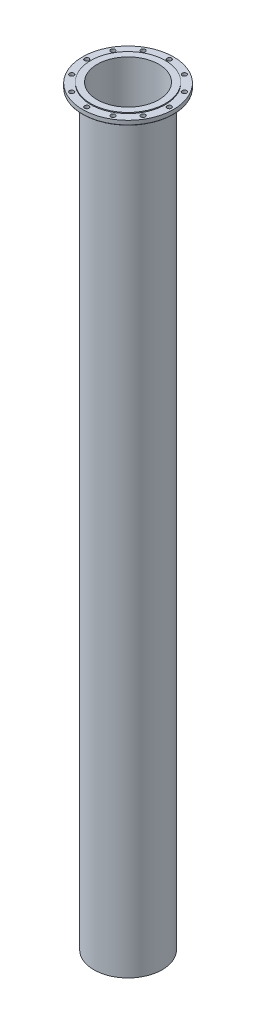
ISO-10303-21;
HEADER;
FILE_DESCRIPTION(('STEP AP214'),'2;1');
FILE_NAME('part.step','',(''),(''),'','','');
FILE_SCHEMA(('AUTOMOTIVE_DESIGN { 1 0 10303 214 1 1 1 1 }'));
ENDSEC;
DATA;
#1=APPLICATION_CONTEXT('core data for automotive mechanical design processes');
#2=APPLICATION_PROTOCOL_DEFINITION('international standard','automotive_design',2000,#1);
#3=PRODUCT_CONTEXT('',#1,'mechanical');
#4=PRODUCT('Part','Part','',(#3));
#5=PRODUCT_RELATED_PRODUCT_CATEGORY('part','',(#4));
#6=PRODUCT_DEFINITION_FORMATION('','',#4);
#7=PRODUCT_DEFINITION_CONTEXT('part definition',#1,'design');
#8=PRODUCT_DEFINITION('design','',#6,#7);
#9=PRODUCT_DEFINITION_SHAPE('','',#8);
#10=(LENGTH_UNIT() NAMED_UNIT(*) SI_UNIT(.MILLI.,.METRE.));
#11=(NAMED_UNIT(*) PLANE_ANGLE_UNIT() SI_UNIT($,.RADIAN.));
#12=(NAMED_UNIT(*) SI_UNIT($,.STERADIAN.) SOLID_ANGLE_UNIT());
#13=UNCERTAINTY_MEASURE_WITH_UNIT(LENGTH_MEASURE(1.E-05),#10,'distance_accuracy_value','');
#14=(GEOMETRIC_REPRESENTATION_CONTEXT(3) GLOBAL_UNCERTAINTY_ASSIGNED_CONTEXT((#13)) GLOBAL_UNIT_ASSIGNED_CONTEXT((#10,
#11,#12)) REPRESENTATION_CONTEXT('',''));
#15=CARTESIAN_POINT('',(0.,0.,0.));
#16=DIRECTION('',(0.,0.,1.));
#17=DIRECTION('',(1.,0.,0.));
#18=AXIS2_PLACEMENT_3D('',#15,#16,#17);
#19=CARTESIAN_POINT('',(-12.8203346951603,-35.3975581395349,2.47179827369602E-13));
#20=DIRECTION('',(0.,-1.,0.));
#21=DIRECTION('',(0.,0.,-1.));
#22=AXIS2_PLACEMENT_3D('',#19,#20,#21);
#23=CYLINDRICAL_SURFACE('',#22,125.);
#24=CARTESIAN_POINT('',(-12.8203346951603,17.6024418604651,2.47179827369602E-13));
#25=DIRECTION('',(0.,-1.,0.));
#26=DIRECTION('',(0.,0.,-1.));
#27=AXIS2_PLACEMENT_3D('',#24,#25,#26);
#28=CIRCLE('',#27,125.);
#29=CARTESIAN_POINT('',(-12.8203346951603,17.6024418604651,-125.));
#30=VERTEX_POINT('',#29);
#31=EDGE_CURVE('E10',#30,#30,#28,.T.);
#32=ORIENTED_EDGE('',*,*,#31,.F.);
#33=EDGE_LOOP('',(#32));
#34=FACE_BOUND('',#33,.T.);
#35=CARTESIAN_POINT('',(-12.8203346951603,-3035.39755813953,2.47179827369602E-13));
#36=DIRECTION('',(0.,-1.,0.));
#37=DIRECTION('',(0.,0.,-1.));
#38=AXIS2_PLACEMENT_3D('',#35,#36,#37);
#39=CIRCLE('',#38,125.);
#40=CARTESIAN_POINT('',(-12.8203346951603,-3035.39755813953,-125.));
#41=VERTEX_POINT('',#40);
#42=EDGE_CURVE('E243',#41,#41,#39,.T.);
#43=ORIENTED_EDGE('',*,*,#42,.T.);
#44=EDGE_LOOP('',(#43));
#45=FACE_BOUND('',#44,.T.);
#46=ADVANCED_FACE('F34',(#34,#45),#23,.F.);
#47=CARTESIAN_POINT('',(-164.32033469516,17.6024418604651,2.47179827369602E-13));
#48=DIRECTION('',(0.,-1.,0.));
#49=DIRECTION('',(0.,0.,-1.));
#50=AXIS2_PLACEMENT_3D('',#47,#48,#49);
#51=PLANE('',#50);
#52=CARTESIAN_POINT('',(-12.8203346951603,17.6024418604651,2.47179827369602E-13));
#53=DIRECTION('',(0.,-1.,0.));
#54=DIRECTION('',(0.,0.,-1.));
#55=AXIS2_PLACEMENT_3D('',#52,#53,#54);
#56=CIRCLE('',#55,151.5);
#57=CARTESIAN_POINT('',(-12.8203346951603,17.6024418604651,-151.5));
#58=VERTEX_POINT('',#57);
#59=EDGE_CURVE('E41',#58,#58,#56,.T.);
#60=ORIENTED_EDGE('',*,*,#59,.F.);
#61=EDGE_LOOP('',(#60));
#62=FACE_BOUND('',#61,.T.);
#63=ORIENTED_EDGE('',*,*,#31,.T.);
#64=EDGE_LOOP('',(#63));
#65=FACE_BOUND('',#64,.T.);
#66=ADVANCED_FACE('F148',(#62,#65),#51,.F.);
#67=CARTESIAN_POINT('',(-12.8203346951603,-35.3975581395349,2.47179827369602E-13));
#68=DIRECTION('',(0.,-1.,0.));
#69=DIRECTION('',(0.,0.,-1.));
#70=AXIS2_PLACEMENT_3D('',#67,#68,#69);
#71=CYLINDRICAL_SURFACE('',#70,151.5);
#72=CARTESIAN_POINT('',(-12.8203346951603,13.6024418604651,2.47179827369602E-13));
#73=DIRECTION('',(0.,-1.,0.));
#74=DIRECTION('',(0.,0.,-1.));
#75=AXIS2_PLACEMENT_3D('',#72,#73,#74);
#76=CIRCLE('',#75,151.5);
#77=CARTESIAN_POINT('',(-12.8203346951603,13.6024418604651,-151.5));
#78=VERTEX_POINT('',#77);
#79=EDGE_CURVE('E46',#78,#78,#76,.T.);
#80=ORIENTED_EDGE('',*,*,#79,.F.);
#81=EDGE_LOOP('',(#80));
#82=FACE_BOUND('',#81,.T.);
#83=ORIENTED_EDGE('',*,*,#59,.T.);
#84=EDGE_LOOP('',(#83));
#85=FACE_BOUND('',#84,.T.);
#86=ADVANCED_FACE('F145',(#82,#85),#71,.T.);
#87=CARTESIAN_POINT('',(-164.32033469516,13.6024418604651,2.47179827369602E-13));
#88=DIRECTION('',(0.,-1.,0.));
#89=DIRECTION('',(0.,0.,-1.));
#90=AXIS2_PLACEMENT_3D('',#87,#88,#89);
#91=PLANE('',#90);
#92=CARTESIAN_POINT('',(-157.879589829055,13.6024418604651,83.7499999999984));
#93=DIRECTION('',(0.,1.,0.));
#94=DIRECTION('',(0.,0.,1.));
#95=AXIS2_PLACEMENT_3D('',#92,#93,#94);
#96=CIRCLE('',#95,9.00000000000001);
#97=CARTESIAN_POINT('',(-157.879589829055,13.6024418604651,92.7499999999984));
#98=VERTEX_POINT('',#97);
#99=EDGE_CURVE('E102',#98,#98,#96,.T.);
#100=ORIENTED_EDGE('',*,*,#99,.F.);
#101=EDGE_LOOP('',(#100));
#102=FACE_BOUND('',#101,.T.);
#103=CARTESIAN_POINT('',(-96.570334695162,13.6024418604651,145.059255133893));
#104=DIRECTION('',(0.,1.,0.));
#105=DIRECTION('',(0.,0.,1.));
#106=AXIS2_PLACEMENT_3D('',#103,#104,#105);
#107=CIRCLE('',#106,9.);
#108=CARTESIAN_POINT('',(-96.570334695162,13.6024418604651,154.059255133893));
#109=VERTEX_POINT('',#108);
#110=EDGE_CURVE('E92',#109,#109,#107,.T.);
#111=ORIENTED_EDGE('',*,*,#110,.F.);
#112=EDGE_LOOP('',(#111));
#113=FACE_BOUND('',#112,.T.);
#114=CARTESIAN_POINT('',(-12.820334695162,13.6024418604651,167.5));
#115=DIRECTION('',(0.,1.,0.));
#116=DIRECTION('',(0.,0.,1.));
#117=AXIS2_PLACEMENT_3D('',#114,#115,#116);
#118=CIRCLE('',#117,9.);
#119=CARTESIAN_POINT('',(-12.820334695162,13.6024418604651,176.5));
#120=VERTEX_POINT('',#119);
#121=EDGE_CURVE('E89',#120,#120,#118,.T.);
#122=ORIENTED_EDGE('',*,*,#121,.F.);
#123=EDGE_LOOP('',(#122));
#124=FACE_BOUND('',#123,.T.);
#125=CARTESIAN_POINT('',(70.9296653048384,13.6024418604651,145.059255133894));
#126=DIRECTION('',(0.,1.,0.));
#127=DIRECTION('',(0.,0.,1.));
#128=AXIS2_PLACEMENT_3D('',#125,#126,#127);
#129=CIRCLE('',#128,9.);
#130=CARTESIAN_POINT('',(70.9296653048384,13.6024418604651,154.059255133894));
#131=VERTEX_POINT('',#130);
#132=EDGE_CURVE('E86',#131,#131,#129,.T.);
#133=ORIENTED_EDGE('',*,*,#132,.F.);
#134=EDGE_LOOP('',(#133));
#135=FACE_BOUND('',#134,.T.);
#136=CARTESIAN_POINT('',(132.238920438732,13.6024418604651,83.7500000000014));
#137=DIRECTION('',(0.,1.,0.));
#138=DIRECTION('',(0.,0.,1.));
#139=AXIS2_PLACEMENT_3D('',#136,#137,#138);
#140=CIRCLE('',#139,9.00000000000001);
#141=CARTESIAN_POINT('',(132.238920438732,13.6024418604651,92.7500000000014));
#142=VERTEX_POINT('',#141);
#143=EDGE_CURVE('E82',#142,#142,#140,.T.);
#144=ORIENTED_EDGE('',*,*,#143,.F.);
#145=EDGE_LOOP('',(#144));
#146=FACE_BOUND('',#145,.T.);
#147=CARTESIAN_POINT('',(154.67966530484,13.6024418604651,1.4187426741053E-12));
#148=DIRECTION('',(0.,1.,0.));
#149=DIRECTION('',(0.,0.,1.));
#150=AXIS2_PLACEMENT_3D('',#147,#148,#149);
#151=CIRCLE('',#150,9.00000000000001);
#152=CARTESIAN_POINT('',(154.67966530484,13.6024418604651,9.00000000000143));
#153=VERTEX_POINT('',#152);
#154=EDGE_CURVE('E78',#153,#153,#151,.T.);
#155=ORIENTED_EDGE('',*,*,#154,.F.);
#156=EDGE_LOOP('',(#155));
#157=FACE_BOUND('',#156,.T.);
#158=CARTESIAN_POINT('',(132.238920438734,13.6024418604651,-83.7499999999989));
#159=DIRECTION('',(0.,1.,0.));
#160=DIRECTION('',(0.,0.,1.));
#161=AXIS2_PLACEMENT_3D('',#158,#159,#160);
#162=CIRCLE('',#161,9.00000000000001);
#163=CARTESIAN_POINT('',(132.238920438734,13.6024418604651,-74.7499999999989));
#164=VERTEX_POINT('',#163);
#165=EDGE_CURVE('E74',#164,#164,#162,.T.);
#166=ORIENTED_EDGE('',*,*,#165,.F.);
#167=EDGE_LOOP('',(#166));
#168=FACE_BOUND('',#167,.T.);
#169=CARTESIAN_POINT('',(-12.8203346951597,13.6024418604651,-167.5));
#170=DIRECTION('',(0.,1.,0.));
#171=DIRECTION('',(0.,0.,1.));
#172=AXIS2_PLACEMENT_3D('',#169,#170,#171);
#173=CIRCLE('',#172,9.);
#174=CARTESIAN_POINT('',(-12.8203346951597,13.6024418604651,-158.5));
#175=VERTEX_POINT('',#174);
#176=EDGE_CURVE('E70',#175,#175,#173,.T.);
#177=ORIENTED_EDGE('',*,*,#176,.F.);
#178=EDGE_LOOP('',(#177));
#179=FACE_BOUND('',#178,.T.);
#180=CARTESIAN_POINT('',(-96.5703346951579,13.6024418604651,-145.059255133895));
#181=DIRECTION('',(0.,1.,0.));
#182=DIRECTION('',(0.,0.,1.));
#183=AXIS2_PLACEMENT_3D('',#180,#181,#182);
#184=CIRCLE('',#183,9.);
#185=CARTESIAN_POINT('',(-96.5703346951579,13.6024418604651,-136.059255133895));
#186=VERTEX_POINT('',#185);
#187=EDGE_CURVE('E66',#186,#186,#184,.T.);
#188=ORIENTED_EDGE('',*,*,#187,.F.);
#189=EDGE_LOOP('',(#188));
#190=FACE_BOUND('',#189,.T.);
#191=CARTESIAN_POINT('',(-157.879589829052,13.6024418604651,-83.7500000000019));
#192=DIRECTION('',(0.,1.,0.));
#193=DIRECTION('',(0.,0.,1.));
#194=AXIS2_PLACEMENT_3D('',#191,#192,#193);
#195=CIRCLE('',#194,9.00000000000001);
#196=CARTESIAN_POINT('',(-157.879589829052,13.6024418604651,-74.7500000000019));
#197=VERTEX_POINT('',#196);
#198=EDGE_CURVE('E62',#197,#197,#195,.T.);
#199=ORIENTED_EDGE('',*,*,#198,.F.);
#200=EDGE_LOOP('',(#199));
#201=FACE_BOUND('',#200,.T.);
#202=CARTESIAN_POINT('',(70.9296653048404,13.6024418604651,-145.059255133893));
#203=DIRECTION('',(0.,1.,0.));
#204=DIRECTION('',(0.,0.,1.));
#205=AXIS2_PLACEMENT_3D('',#202,#203,#204);
#206=CIRCLE('',#205,9.);
#207=CARTESIAN_POINT('',(70.9296653048404,13.6024418604651,-136.059255133893));
#208=VERTEX_POINT('',#207);
#209=EDGE_CURVE('E58',#208,#208,#206,.T.);
#210=ORIENTED_EDGE('',*,*,#209,.F.);
#211=EDGE_LOOP('',(#210));
#212=FACE_BOUND('',#211,.T.);
#213=CARTESIAN_POINT('',(-180.32033469516,13.6024418604651,2.47179827369602E-13));
#214=DIRECTION('',(0.,1.,0.));
#215=DIRECTION('',(0.,0.,1.));
#216=AXIS2_PLACEMENT_3D('',#213,#214,#215);
#217=CIRCLE('',#216,9.00000000000001);
#218=CARTESIAN_POINT('',(-180.32033469516,13.6024418604651,9.00000000000026));
#219=VERTEX_POINT('',#218);
#220=EDGE_CURVE('E54',#219,#219,#217,.T.);
#221=ORIENTED_EDGE('',*,*,#220,.F.);
#222=EDGE_LOOP('',(#221));
#223=FACE_BOUND('',#222,.T.);
#224=CARTESIAN_POINT('',(-12.8203346951603,13.6024418604651,2.47179827369602E-13));
#225=DIRECTION('',(0.,-1.,0.));
#226=DIRECTION('',(0.,0.,-1.));
#227=AXIS2_PLACEMENT_3D('',#224,#225,#226);
#228=CIRCLE('',#227,185.);
#229=CARTESIAN_POINT('',(-12.8203346951603,13.6024418604651,-185.));
#230=VERTEX_POINT('',#229);
#231=EDGE_CURVE('E138',#230,#230,#228,.T.);
#232=ORIENTED_EDGE('',*,*,#231,.F.);
#233=EDGE_LOOP('',(#232));
#234=FACE_BOUND('',#233,.T.);
#235=ORIENTED_EDGE('',*,*,#79,.T.);
#236=EDGE_LOOP('',(#235));
#237=FACE_BOUND('',#236,.T.);
#238=ADVANCED_FACE('F143',(#102,#113,#124,#135,#146,#157,#168,#179,#190,#201,#212,#223,#234,
#237),#91,.F.);
#239=CARTESIAN_POINT('',(-12.8203346951603,-35.3975581395349,2.47179827369602E-13));
#240=DIRECTION('',(0.,-1.,0.));
#241=DIRECTION('',(0.,0.,-1.));
#242=AXIS2_PLACEMENT_3D('',#239,#240,#241);
#243=CYLINDRICAL_SURFACE('',#242,185.);
#244=CARTESIAN_POINT('',(-12.8203346951603,-2.39755813953486,2.47179827369602E-13));
#245=DIRECTION('',(0.,-1.,0.));
#246=DIRECTION('',(0.,0.,-1.));
#247=AXIS2_PLACEMENT_3D('',#244,#245,#246);
#248=CIRCLE('',#247,185.);
#249=CARTESIAN_POINT('',(-12.8203346951603,-2.39755813953486,-185.));
#250=VERTEX_POINT('',#249);
#251=EDGE_CURVE('E135',#250,#250,#248,.T.);
#252=ORIENTED_EDGE('',*,*,#251,.F.);
#253=EDGE_LOOP('',(#252));
#254=FACE_BOUND('',#253,.T.);
#255=ORIENTED_EDGE('',*,*,#231,.T.);
#256=EDGE_LOOP('',(#255));
#257=FACE_BOUND('',#256,.T.);
#258=ADVANCED_FACE('F160',(#254,#257),#243,.T.);
#259=CARTESIAN_POINT('',(-12.8203346951603,-2.39755813953486,2.47179827369602E-13));
#260=DIRECTION('',(0.,-1.,0.));
#261=DIRECTION('',(0.,0.,-1.));
#262=AXIS2_PLACEMENT_3D('',#259,#260,#261);
#263=TOROIDAL_SURFACE('',#262,183.,2.);
#264=CARTESIAN_POINT('',(-12.8203346951603,-4.39755813953487,2.47179827369602E-13));
#265=DIRECTION('',(0.,-1.,0.));
#266=DIRECTION('',(0.,0.,-1.));
#267=AXIS2_PLACEMENT_3D('',#264,#265,#266);
#268=CIRCLE('',#267,183.);
#269=CARTESIAN_POINT('',(-12.8203346951603,-4.39755813953487,-183.));
#270=VERTEX_POINT('',#269);
#271=EDGE_CURVE('E132',#270,#270,#268,.T.);
#272=ORIENTED_EDGE('',*,*,#271,.F.);
#273=EDGE_LOOP('',(#272));
#274=FACE_BOUND('',#273,.T.);
#275=ORIENTED_EDGE('',*,*,#251,.T.);
#276=EDGE_LOOP('',(#275));
#277=FACE_BOUND('',#276,.T.);
#278=ADVANCED_FACE('F164',(#274,#277),#263,.T.);
#279=CARTESIAN_POINT('',(-195.82033469516,-4.39755813953487,2.47179827369602E-13));
#280=DIRECTION('',(0.,1.,0.));
#281=DIRECTION('',(0.,0.,1.));
#282=AXIS2_PLACEMENT_3D('',#279,#280,#281);
#283=PLANE('',#282);
#284=CARTESIAN_POINT('',(-157.879589829055,-4.39755813953487,83.7499999999984));
#285=DIRECTION('',(0.,1.,0.));
#286=DIRECTION('',(0.,0.,1.));
#287=AXIS2_PLACEMENT_3D('',#284,#285,#286);
#288=CIRCLE('',#287,9.00000000000001);
#289=CARTESIAN_POINT('',(-157.879589829055,-4.39755813953487,92.7499999999984));
#290=VERTEX_POINT('',#289);
#291=EDGE_CURVE('E37',#290,#290,#288,.T.);
#292=ORIENTED_EDGE('',*,*,#291,.T.);
#293=EDGE_LOOP('',(#292));
#294=FACE_BOUND('',#293,.T.);
#295=CARTESIAN_POINT('',(-96.570334695162,-4.39755813953487,145.059255133893));
#296=DIRECTION('',(0.,1.,0.));
#297=DIRECTION('',(0.,0.,1.));
#298=AXIS2_PLACEMENT_3D('',#295,#296,#297);
#299=CIRCLE('',#298,9.);
#300=CARTESIAN_POINT('',(-96.570334695162,-4.39755813953487,154.059255133893));
#301=VERTEX_POINT('',#300);
#302=EDGE_CURVE('E90',#301,#301,#299,.T.);
#303=ORIENTED_EDGE('',*,*,#302,.T.);
#304=EDGE_LOOP('',(#303));
#305=FACE_BOUND('',#304,.T.);
#306=CARTESIAN_POINT('',(-12.820334695162,-4.39755813953487,167.5));
#307=DIRECTION('',(0.,1.,0.));
#308=DIRECTION('',(0.,0.,1.));
#309=AXIS2_PLACEMENT_3D('',#306,#307,#308);
#310=CIRCLE('',#309,9.);
#311=CARTESIAN_POINT('',(-12.820334695162,-4.39755813953487,176.5));
#312=VERTEX_POINT('',#311);
#313=EDGE_CURVE('E87',#312,#312,#310,.T.);
#314=ORIENTED_EDGE('',*,*,#313,.T.);
#315=EDGE_LOOP('',(#314));
#316=FACE_BOUND('',#315,.T.);
#317=CARTESIAN_POINT('',(70.9296653048384,-4.39755813953487,145.059255133894));
#318=DIRECTION('',(0.,1.,0.));
#319=DIRECTION('',(0.,0.,1.));
#320=AXIS2_PLACEMENT_3D('',#317,#318,#319);
#321=CIRCLE('',#320,9.);
#322=CARTESIAN_POINT('',(70.9296653048384,-4.39755813953487,154.059255133894));
#323=VERTEX_POINT('',#322);
#324=EDGE_CURVE('E83',#323,#323,#321,.T.);
#325=ORIENTED_EDGE('',*,*,#324,.T.);
#326=EDGE_LOOP('',(#325));
#327=FACE_BOUND('',#326,.T.);
#328=CARTESIAN_POINT('',(132.238920438732,-4.39755813953487,83.7500000000014));
#329=DIRECTION('',(0.,1.,0.));
#330=DIRECTION('',(0.,0.,1.));
#331=AXIS2_PLACEMENT_3D('',#328,#329,#330);
#332=CIRCLE('',#331,9.00000000000001);
#333=CARTESIAN_POINT('',(132.238920438732,-4.39755813953487,92.7500000000014));
#334=VERTEX_POINT('',#333);
#335=EDGE_CURVE('E79',#334,#334,#332,.T.);
#336=ORIENTED_EDGE('',*,*,#335,.T.);
#337=EDGE_LOOP('',(#336));
#338=FACE_BOUND('',#337,.T.);
#339=CARTESIAN_POINT('',(154.67966530484,-4.39755813953487,1.4187426741053E-12));
#340=DIRECTION('',(0.,1.,0.));
#341=DIRECTION('',(0.,0.,1.));
#342=AXIS2_PLACEMENT_3D('',#339,#340,#341);
#343=CIRCLE('',#342,9.00000000000001);
#344=CARTESIAN_POINT('',(154.67966530484,-4.39755813953487,9.00000000000143));
#345=VERTEX_POINT('',#344);
#346=EDGE_CURVE('E75',#345,#345,#343,.T.);
#347=ORIENTED_EDGE('',*,*,#346,.T.);
#348=EDGE_LOOP('',(#347));
#349=FACE_BOUND('',#348,.T.);
#350=CARTESIAN_POINT('',(132.238920438734,-4.39755813953487,-83.7499999999989));
#351=DIRECTION('',(0.,1.,0.));
#352=DIRECTION('',(0.,0.,1.));
#353=AXIS2_PLACEMENT_3D('',#350,#351,#352);
#354=CIRCLE('',#353,9.00000000000001);
#355=CARTESIAN_POINT('',(132.238920438734,-4.39755813953487,-74.7499999999989));
#356=VERTEX_POINT('',#355);
#357=EDGE_CURVE('E71',#356,#356,#354,.T.);
#358=ORIENTED_EDGE('',*,*,#357,.T.);
#359=EDGE_LOOP('',(#358));
#360=FACE_BOUND('',#359,.T.);
#361=CARTESIAN_POINT('',(-12.8203346951597,-4.39755813953487,-167.5));
#362=DIRECTION('',(0.,1.,0.));
#363=DIRECTION('',(0.,0.,1.));
#364=AXIS2_PLACEMENT_3D('',#361,#362,#363);
#365=CIRCLE('',#364,9.);
#366=CARTESIAN_POINT('',(-12.8203346951597,-4.39755813953487,-158.5));
#367=VERTEX_POINT('',#366);
#368=EDGE_CURVE('E67',#367,#367,#365,.T.);
#369=ORIENTED_EDGE('',*,*,#368,.T.);
#370=EDGE_LOOP('',(#369));
#371=FACE_BOUND('',#370,.T.);
#372=CARTESIAN_POINT('',(-96.5703346951579,-4.39755813953487,-145.059255133895));
#373=DIRECTION('',(0.,1.,0.));
#374=DIRECTION('',(0.,0.,1.));
#375=AXIS2_PLACEMENT_3D('',#372,#373,#374);
#376=CIRCLE('',#375,9.);
#377=CARTESIAN_POINT('',(-96.5703346951579,-4.39755813953487,-136.059255133895));
#378=VERTEX_POINT('',#377);
#379=EDGE_CURVE('E63',#378,#378,#376,.T.);
#380=ORIENTED_EDGE('',*,*,#379,.T.);
#381=EDGE_LOOP('',(#380));
#382=FACE_BOUND('',#381,.T.);
#383=CARTESIAN_POINT('',(-157.879589829052,-4.39755813953487,-83.7500000000019));
#384=DIRECTION('',(0.,1.,0.));
#385=DIRECTION('',(0.,0.,1.));
#386=AXIS2_PLACEMENT_3D('',#383,#384,#385);
#387=CIRCLE('',#386,9.00000000000001);
#388=CARTESIAN_POINT('',(-157.879589829052,-4.39755813953487,-74.7500000000019));
#389=VERTEX_POINT('',#388);
#390=EDGE_CURVE('E59',#389,#389,#387,.T.);
#391=ORIENTED_EDGE('',*,*,#390,.T.);
#392=EDGE_LOOP('',(#391));
#393=FACE_BOUND('',#392,.T.);
#394=CARTESIAN_POINT('',(70.9296653048404,-4.39755813953487,-145.059255133893));
#395=DIRECTION('',(0.,1.,0.));
#396=DIRECTION('',(0.,0.,1.));
#397=AXIS2_PLACEMENT_3D('',#394,#395,#396);
#398=CIRCLE('',#397,9.);
#399=CARTESIAN_POINT('',(70.9296653048404,-4.39755813953487,-136.059255133893));
#400=VERTEX_POINT('',#399);
#401=EDGE_CURVE('E55',#400,#400,#398,.T.);
#402=ORIENTED_EDGE('',*,*,#401,.T.);
#403=EDGE_LOOP('',(#402));
#404=FACE_BOUND('',#403,.T.);
#405=CARTESIAN_POINT('',(-180.32033469516,-4.39755813953487,2.47179827369602E-13));
#406=DIRECTION('',(0.,1.,0.));
#407=DIRECTION('',(0.,0.,1.));
#408=AXIS2_PLACEMENT_3D('',#405,#406,#407);
#409=CIRCLE('',#408,9.00000000000001);
#410=CARTESIAN_POINT('',(-180.32033469516,-4.39755813953487,9.00000000000026));
#411=VERTEX_POINT('',#410);
#412=EDGE_CURVE('E50',#411,#411,#409,.T.);
#413=ORIENTED_EDGE('',*,*,#412,.T.);
#414=EDGE_LOOP('',(#413));
#415=FACE_BOUND('',#414,.T.);
#416=CARTESIAN_POINT('',(-12.8203346951603,-4.39755813953487,2.47179827369602E-13));
#417=DIRECTION('',(0.,-1.,0.));
#418=DIRECTION('',(0.,0.,-1.));
#419=AXIS2_PLACEMENT_3D('',#416,#417,#418);
#420=CIRCLE('',#419,149.961434146887);
#421=CARTESIAN_POINT('',(-12.8203346951603,-4.39755813953487,-149.961434146887));
#422=VERTEX_POINT('',#421);
#423=EDGE_CURVE('E129',#422,#422,#420,.T.);
#424=ORIENTED_EDGE('',*,*,#423,.F.);
#425=EDGE_LOOP('',(#424));
#426=FACE_BOUND('',#425,.T.);
#427=ORIENTED_EDGE('',*,*,#271,.T.);
#428=EDGE_LOOP('',(#427));
#429=FACE_BOUND('',#428,.T.);
#430=ADVANCED_FACE('F168',(#294,#305,#316,#327,#338,#349,#360,#371,#382,#393,#404,#415,#426,
#429),#283,.F.);
#431=CARTESIAN_POINT('',(-12.8203346951603,-11.3975581395349,2.47179827369602E-13));
#432=DIRECTION('',(0.,-1.,0.));
#433=DIRECTION('',(0.,0.,-1.));
#434=AXIS2_PLACEMENT_3D('',#431,#432,#433);
#435=TOROIDAL_SURFACE('',#434,149.961434146887,6.99999999999999);
#436=CARTESIAN_POINT('',(-12.8203346951603,-10.2829310677625,2.47179827369602E-13));
#437=DIRECTION('',(0.,-1.,0.));
#438=DIRECTION('',(0.,0.,-1.));
#439=AXIS2_PLACEMENT_3D('',#436,#437,#438);
#440=CIRCLE('',#439,143.050746301899);
#441=CARTESIAN_POINT('',(-12.8203346951603,-10.2829310677625,-143.050746301899));
#442=VERTEX_POINT('',#441);
#443=EDGE_CURVE('E126',#442,#442,#440,.T.);
#444=ORIENTED_EDGE('',*,*,#443,.F.);
#445=EDGE_LOOP('',(#444));
#446=FACE_BOUND('',#445,.T.);
#447=ORIENTED_EDGE('',*,*,#423,.T.);
#448=EDGE_LOOP('',(#447));
#449=FACE_BOUND('',#448,.T.);
#450=ADVANCED_FACE('F172',(#446,#449),#435,.F.);
#451=CARTESIAN_POINT('',(-12.8203346951603,-10.2829310677625,2.47179827369602E-13));
#452=DIRECTION('',(0.,1.,0.));
#453=DIRECTION('',(0.,0.,1.));
#454=AXIS2_PLACEMENT_3D('',#451,#452,#453);
#455=CONICAL_SURFACE('',#454,143.050746301899,0.15991312315822);
#456=CARTESIAN_POINT('',(-12.8203346951603,-35.3975581395349,2.47179827369602E-13));
#457=DIRECTION('',(0.,-1.,0.));
#458=DIRECTION('',(0.,0.,-1.));
#459=AXIS2_PLACEMENT_3D('',#456,#457,#458);
#460=CIRCLE('',#459,139.);
#461=CARTESIAN_POINT('',(-12.8203346951603,-35.3975581395349,-139.));
#462=VERTEX_POINT('',#461);
#463=EDGE_CURVE('E53',#462,#462,#460,.T.);
#464=ORIENTED_EDGE('',*,*,#463,.F.);
#465=EDGE_LOOP('',(#464));
#466=FACE_BOUND('',#465,.T.);
#467=ORIENTED_EDGE('',*,*,#443,.T.);
#468=EDGE_LOOP('',(#467));
#469=FACE_BOUND('',#468,.T.);
#470=ADVANCED_FACE('F176',(#466,#469),#455,.T.);
#471=CARTESIAN_POINT('',(-180.32033469516,-35.3975581395349,2.47179827369602E-13));
#472=DIRECTION('',(0.,1.,0.));
#473=DIRECTION('',(0.,0.,1.));
#474=AXIS2_PLACEMENT_3D('',#471,#472,#473);
#475=CYLINDRICAL_SURFACE('',#474,9.00000000000001);
#476=ORIENTED_EDGE('',*,*,#220,.T.);
#477=EDGE_LOOP('',(#476));
#478=FACE_BOUND('',#477,.T.);
#479=ORIENTED_EDGE('',*,*,#412,.F.);
#480=EDGE_LOOP('',(#479));
#481=FACE_BOUND('',#480,.T.);
#482=ADVANCED_FACE('F180',(#478,#481),#475,.F.);
#483=CARTESIAN_POINT('',(70.9296653048404,-35.3975581395349,-145.059255133893));
#484=DIRECTION('',(0.,1.,0.));
#485=DIRECTION('',(0.,0.,1.));
#486=AXIS2_PLACEMENT_3D('',#483,#484,#485);
#487=CYLINDRICAL_SURFACE('',#486,9.);
#488=ORIENTED_EDGE('',*,*,#209,.T.);
#489=EDGE_LOOP('',(#488));
#490=FACE_BOUND('',#489,.T.);
#491=ORIENTED_EDGE('',*,*,#401,.F.);
#492=EDGE_LOOP('',(#491));
#493=FACE_BOUND('',#492,.T.);
#494=ADVANCED_FACE('F184',(#490,#493),#487,.F.);
#495=CARTESIAN_POINT('',(-157.879589829052,-35.3975581395349,-83.7500000000019));
#496=DIRECTION('',(0.,1.,0.));
#497=DIRECTION('',(0.,0.,1.));
#498=AXIS2_PLACEMENT_3D('',#495,#496,#497);
#499=CYLINDRICAL_SURFACE('',#498,9.00000000000001);
#500=ORIENTED_EDGE('',*,*,#198,.T.);
#501=EDGE_LOOP('',(#500));
#502=FACE_BOUND('',#501,.T.);
#503=ORIENTED_EDGE('',*,*,#390,.F.);
#504=EDGE_LOOP('',(#503));
#505=FACE_BOUND('',#504,.T.);
#506=ADVANCED_FACE('F188',(#502,#505),#499,.F.);
#507=CARTESIAN_POINT('',(-96.5703346951579,-35.3975581395349,-145.059255133895));
#508=DIRECTION('',(0.,1.,0.));
#509=DIRECTION('',(0.,0.,1.));
#510=AXIS2_PLACEMENT_3D('',#507,#508,#509);
#511=CYLINDRICAL_SURFACE('',#510,9.);
#512=ORIENTED_EDGE('',*,*,#187,.T.);
#513=EDGE_LOOP('',(#512));
#514=FACE_BOUND('',#513,.T.);
#515=ORIENTED_EDGE('',*,*,#379,.F.);
#516=EDGE_LOOP('',(#515));
#517=FACE_BOUND('',#516,.T.);
#518=ADVANCED_FACE('F192',(#514,#517),#511,.F.);
#519=CARTESIAN_POINT('',(-12.8203346951597,-35.3975581395349,-167.5));
#520=DIRECTION('',(0.,1.,0.));
#521=DIRECTION('',(0.,0.,1.));
#522=AXIS2_PLACEMENT_3D('',#519,#520,#521);
#523=CYLINDRICAL_SURFACE('',#522,9.);
#524=ORIENTED_EDGE('',*,*,#176,.T.);
#525=EDGE_LOOP('',(#524));
#526=FACE_BOUND('',#525,.T.);
#527=ORIENTED_EDGE('',*,*,#368,.F.);
#528=EDGE_LOOP('',(#527));
#529=FACE_BOUND('',#528,.T.);
#530=ADVANCED_FACE('F196',(#526,#529),#523,.F.);
#531=CARTESIAN_POINT('',(132.238920438734,-35.3975581395349,-83.7499999999989));
#532=DIRECTION('',(0.,1.,0.));
#533=DIRECTION('',(0.,0.,1.));
#534=AXIS2_PLACEMENT_3D('',#531,#532,#533);
#535=CYLINDRICAL_SURFACE('',#534,9.00000000000001);
#536=ORIENTED_EDGE('',*,*,#165,.T.);
#537=EDGE_LOOP('',(#536));
#538=FACE_BOUND('',#537,.T.);
#539=ORIENTED_EDGE('',*,*,#357,.F.);
#540=EDGE_LOOP('',(#539));
#541=FACE_BOUND('',#540,.T.);
#542=ADVANCED_FACE('F200',(#538,#541),#535,.F.);
#543=CARTESIAN_POINT('',(154.67966530484,-35.3975581395349,1.4187426741053E-12));
#544=DIRECTION('',(0.,1.,0.));
#545=DIRECTION('',(0.,0.,1.));
#546=AXIS2_PLACEMENT_3D('',#543,#544,#545);
#547=CYLINDRICAL_SURFACE('',#546,9.00000000000001);
#548=ORIENTED_EDGE('',*,*,#154,.T.);
#549=EDGE_LOOP('',(#548));
#550=FACE_BOUND('',#549,.T.);
#551=ORIENTED_EDGE('',*,*,#346,.F.);
#552=EDGE_LOOP('',(#551));
#553=FACE_BOUND('',#552,.T.);
#554=ADVANCED_FACE('F204',(#550,#553),#547,.F.);
#555=CARTESIAN_POINT('',(132.238920438732,-35.3975581395349,83.7500000000014));
#556=DIRECTION('',(0.,1.,0.));
#557=DIRECTION('',(0.,0.,1.));
#558=AXIS2_PLACEMENT_3D('',#555,#556,#557);
#559=CYLINDRICAL_SURFACE('',#558,9.00000000000001);
#560=ORIENTED_EDGE('',*,*,#143,.T.);
#561=EDGE_LOOP('',(#560));
#562=FACE_BOUND('',#561,.T.);
#563=ORIENTED_EDGE('',*,*,#335,.F.);
#564=EDGE_LOOP('',(#563));
#565=FACE_BOUND('',#564,.T.);
#566=ADVANCED_FACE('F208',(#562,#565),#559,.F.);
#567=CARTESIAN_POINT('',(70.9296653048384,-35.3975581395349,145.059255133894));
#568=DIRECTION('',(0.,1.,0.));
#569=DIRECTION('',(0.,0.,1.));
#570=AXIS2_PLACEMENT_3D('',#567,#568,#569);
#571=CYLINDRICAL_SURFACE('',#570,9.);
#572=ORIENTED_EDGE('',*,*,#132,.T.);
#573=EDGE_LOOP('',(#572));
#574=FACE_BOUND('',#573,.T.);
#575=ORIENTED_EDGE('',*,*,#324,.F.);
#576=EDGE_LOOP('',(#575));
#577=FACE_BOUND('',#576,.T.);
#578=ADVANCED_FACE('F212',(#574,#577),#571,.F.);
#579=CARTESIAN_POINT('',(-12.820334695162,-35.3975581395349,167.5));
#580=DIRECTION('',(0.,1.,0.));
#581=DIRECTION('',(0.,0.,1.));
#582=AXIS2_PLACEMENT_3D('',#579,#580,#581);
#583=CYLINDRICAL_SURFACE('',#582,9.);
#584=ORIENTED_EDGE('',*,*,#121,.T.);
#585=EDGE_LOOP('',(#584));
#586=FACE_BOUND('',#585,.T.);
#587=ORIENTED_EDGE('',*,*,#313,.F.);
#588=EDGE_LOOP('',(#587));
#589=FACE_BOUND('',#588,.T.);
#590=ADVANCED_FACE('F216',(#586,#589),#583,.F.);
#591=CARTESIAN_POINT('',(-96.570334695162,-35.3975581395349,145.059255133893));
#592=DIRECTION('',(0.,1.,0.));
#593=DIRECTION('',(0.,0.,1.));
#594=AXIS2_PLACEMENT_3D('',#591,#592,#593);
#595=CYLINDRICAL_SURFACE('',#594,9.);
#596=ORIENTED_EDGE('',*,*,#110,.T.);
#597=EDGE_LOOP('',(#596));
#598=FACE_BOUND('',#597,.T.);
#599=ORIENTED_EDGE('',*,*,#302,.F.);
#600=EDGE_LOOP('',(#599));
#601=FACE_BOUND('',#600,.T.);
#602=ADVANCED_FACE('F220',(#598,#601),#595,.F.);
#603=CARTESIAN_POINT('',(-157.879589829055,-35.3975581395349,83.7499999999984));
#604=DIRECTION('',(0.,1.,0.));
#605=DIRECTION('',(0.,0.,1.));
#606=AXIS2_PLACEMENT_3D('',#603,#604,#605);
#607=CYLINDRICAL_SURFACE('',#606,9.00000000000001);
#608=ORIENTED_EDGE('',*,*,#99,.T.);
#609=EDGE_LOOP('',(#608));
#610=FACE_BOUND('',#609,.T.);
#611=ORIENTED_EDGE('',*,*,#291,.F.);
#612=EDGE_LOOP('',(#611));
#613=FACE_BOUND('',#612,.T.);
#614=ADVANCED_FACE('F224',(#610,#613),#607,.F.);
#615=CARTESIAN_POINT('',(-12.8203346951603,-3035.39755813953,2.47179827369602E-13));
#616=DIRECTION('',(0.,-1.,0.));
#617=DIRECTION('',(0.,0.,-1.));
#618=AXIS2_PLACEMENT_3D('',#615,#616,#617);
#619=PLANE('',#618);
#620=CARTESIAN_POINT('',(-12.8203346951603,-3035.39755813953,2.47179827369602E-13));
#621=DIRECTION('',(0.,-1.,0.));
#622=DIRECTION('',(0.,0.,-1.));
#623=AXIS2_PLACEMENT_3D('',#620,#621,#622);
#624=CIRCLE('',#623,139.);
#625=CARTESIAN_POINT('',(-12.8203346951603,-3035.39755813953,-139.));
#626=VERTEX_POINT('',#625);
#627=EDGE_CURVE('E240',#626,#626,#624,.T.);
#628=ORIENTED_EDGE('',*,*,#627,.T.);
#629=EDGE_LOOP('',(#628));
#630=FACE_BOUND('',#629,.T.);
#631=ORIENTED_EDGE('',*,*,#42,.F.);
#632=EDGE_LOOP('',(#631));
#633=FACE_BOUND('',#632,.T.);
#634=ADVANCED_FACE('F227',(#630,#633),#619,.T.);
#635=CARTESIAN_POINT('',(-12.8203346951603,-3035.39755813953,2.47179827369602E-13));
#636=DIRECTION('',(0.,1.,0.));
#637=DIRECTION('',(0.,0.,1.));
#638=AXIS2_PLACEMENT_3D('',#635,#636,#637);
#639=CYLINDRICAL_SURFACE('',#638,139.);
#640=ORIENTED_EDGE('',*,*,#627,.F.);
#641=EDGE_LOOP('',(#640));
#642=FACE_BOUND('',#641,.T.);
#643=ORIENTED_EDGE('',*,*,#463,.T.);
#644=EDGE_LOOP('',(#643));
#645=FACE_BOUND('',#644,.T.);
#646=ADVANCED_FACE('F229',(#642,#645),#639,.T.);
#647=CLOSED_SHELL('',(#46,#66,#86,#238,#258,#278,#430,#450,#470,#482,#494,#506,#518,#530,#542,
#554,#566,#578,#590,#602,#614,#634,#646));
#648=MANIFOLD_SOLID_BREP('B2',#647);
#649=ADVANCED_BREP_SHAPE_REPRESENTATION('',(#18,#648),#14);
#650=SHAPE_DEFINITION_REPRESENTATION(#9,#649);
ENDSEC;
END-ISO-10303-21;
